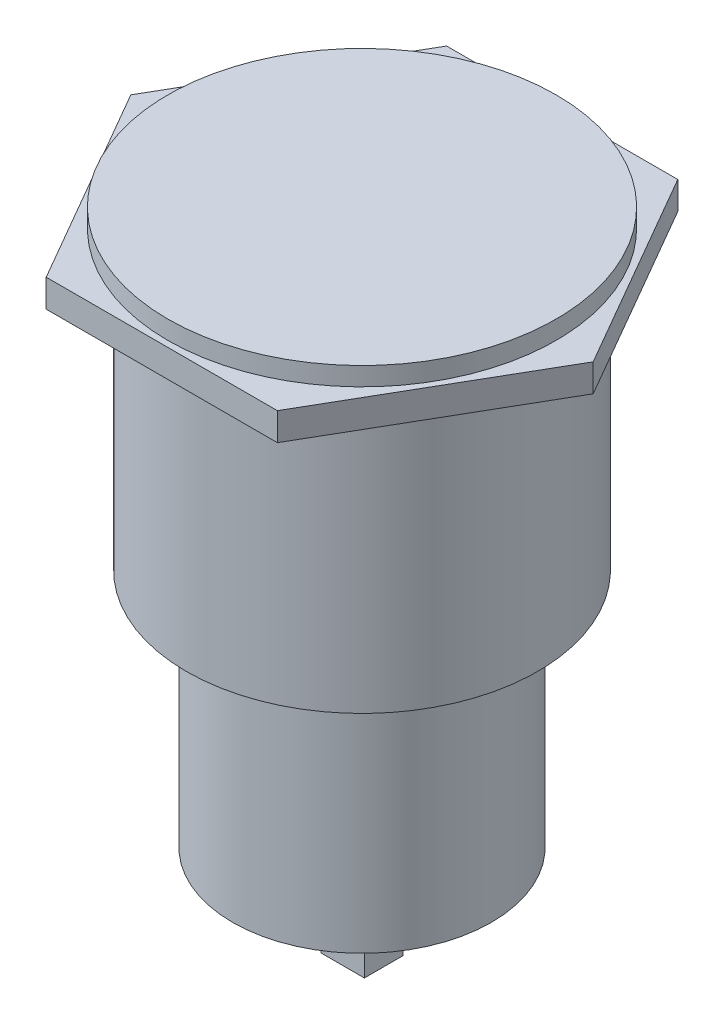
ISO-10303-21;
HEADER;
FILE_DESCRIPTION(('STEP AP214'),'2;1');
FILE_NAME('part.step','',(''),(''),'','','');
FILE_SCHEMA(('AUTOMOTIVE_DESIGN { 1 0 10303 214 1 1 1 1 }'));
ENDSEC;
DATA;
#1=APPLICATION_CONTEXT('core data for automotive mechanical design processes');
#2=APPLICATION_PROTOCOL_DEFINITION('international standard','automotive_design',2000,#1);
#3=PRODUCT_CONTEXT('',#1,'mechanical');
#4=PRODUCT('Part','Part','',(#3));
#5=PRODUCT_RELATED_PRODUCT_CATEGORY('part','',(#4));
#6=PRODUCT_DEFINITION_FORMATION('','',#4);
#7=PRODUCT_DEFINITION_CONTEXT('part definition',#1,'design');
#8=PRODUCT_DEFINITION('design','',#6,#7);
#9=PRODUCT_DEFINITION_SHAPE('','',#8);
#10=(LENGTH_UNIT() NAMED_UNIT(*) SI_UNIT(.MILLI.,.METRE.));
#11=(NAMED_UNIT(*) PLANE_ANGLE_UNIT() SI_UNIT($,.RADIAN.));
#12=(NAMED_UNIT(*) SI_UNIT($,.STERADIAN.) SOLID_ANGLE_UNIT());
#13=UNCERTAINTY_MEASURE_WITH_UNIT(LENGTH_MEASURE(1.E-05),#10,'distance_accuracy_value','');
#14=(GEOMETRIC_REPRESENTATION_CONTEXT(3) GLOBAL_UNCERTAINTY_ASSIGNED_CONTEXT((#13)) GLOBAL_UNIT_ASSIGNED_CONTEXT((#10,
#11,#12)) REPRESENTATION_CONTEXT('',''));
#15=CARTESIAN_POINT('',(0.,0.,0.));
#16=DIRECTION('',(0.,0.,1.));
#17=DIRECTION('',(1.,0.,0.));
#18=AXIS2_PLACEMENT_3D('',#15,#16,#17);
#19=CARTESIAN_POINT('',(0.,-14.5,0.));
#20=DIRECTION('',(0.,1.,0.));
#21=DIRECTION('',(0.,0.,1.));
#22=AXIS2_PLACEMENT_3D('',#19,#20,#21);
#23=CYLINDRICAL_SURFACE('',#22,9.5);
#24=CARTESIAN_POINT('',(0.,-14.5,0.));
#25=DIRECTION('',(0.,1.,0.));
#26=DIRECTION('',(0.,0.,1.));
#27=AXIS2_PLACEMENT_3D('',#24,#25,#26);
#28=CIRCLE('',#27,9.5);
#29=CARTESIAN_POINT('',(0.,-14.5,9.5));
#30=VERTEX_POINT('',#29);
#31=EDGE_CURVE('E187',#30,#30,#28,.T.);
#32=CARTESIAN_POINT('',(0.,0.,0.));
#33=DIRECTION('',(0.,1.,0.));
#34=DIRECTION('',(0.,0.,1.));
#35=AXIS2_PLACEMENT_3D('',#32,#33,#34);
#36=CIRCLE('',#35,9.5);
#37=CARTESIAN_POINT('',(0.,0.,9.5));
#38=VERTEX_POINT('',#37);
#39=EDGE_CURVE('E36',#38,#38,#36,.T.);
#40=CARTESIAN_POINT('',(0.,-14.5,9.5));
#41=CARTESIAN_POINT('',(0.,-14.3489583333333,9.5));
#42=CARTESIAN_POINT('',(0.,-14.1979166666667,9.5));
#43=CARTESIAN_POINT('',(0.,-13.8958333333333,9.5));
#44=CARTESIAN_POINT('',(0.,-13.7447916666667,9.5));
#45=CARTESIAN_POINT('',(0.,-13.4427083333333,9.5));
#46=CARTESIAN_POINT('',(0.,-13.2916666666667,9.5));
#47=CARTESIAN_POINT('',(0.,-12.9895833333333,9.5));
#48=CARTESIAN_POINT('',(0.,-12.8385416666667,9.5));
#49=CARTESIAN_POINT('',(0.,-12.5364583333333,9.5));
#50=CARTESIAN_POINT('',(0.,-12.3854166666667,9.5));
#51=CARTESIAN_POINT('',(0.,-12.0833333333333,9.5));
#52=CARTESIAN_POINT('',(0.,-11.9322916666667,9.5));
#53=CARTESIAN_POINT('',(0.,-11.6302083333333,9.5));
#54=CARTESIAN_POINT('',(0.,-11.4791666666667,9.5));
#55=CARTESIAN_POINT('',(0.,-11.1770833333333,9.5));
#56=CARTESIAN_POINT('',(0.,-11.0260416666667,9.5));
#57=CARTESIAN_POINT('',(0.,-10.7239583333333,9.5));
#58=CARTESIAN_POINT('',(0.,-10.5729166666667,9.5));
#59=CARTESIAN_POINT('',(0.,-10.2708333333333,9.5));
#60=CARTESIAN_POINT('',(0.,-10.1197916666667,9.5));
#61=CARTESIAN_POINT('',(0.,-9.81770833333333,9.5));
#62=CARTESIAN_POINT('',(0.,-9.66666666666667,9.5));
#63=CARTESIAN_POINT('',(0.,-9.36458333333333,9.5));
#64=CARTESIAN_POINT('',(0.,-9.21354166666667,9.5));
#65=CARTESIAN_POINT('',(0.,-8.91145833333333,9.5));
#66=CARTESIAN_POINT('',(0.,-8.76041666666667,9.5));
#67=CARTESIAN_POINT('',(0.,-8.45833333333333,9.5));
#68=CARTESIAN_POINT('',(0.,-8.30729166666667,9.5));
#69=CARTESIAN_POINT('',(0.,-8.00520833333333,9.5));
#70=CARTESIAN_POINT('',(0.,-7.85416666666667,9.5));
#71=CARTESIAN_POINT('',(0.,-7.55208333333333,9.5));
#72=CARTESIAN_POINT('',(0.,-7.40104166666667,9.5));
#73=CARTESIAN_POINT('',(0.,-7.09895833333333,9.5));
#74=CARTESIAN_POINT('',(0.,-6.94791666666667,9.5));
#75=CARTESIAN_POINT('',(0.,-6.64583333333333,9.5));
#76=CARTESIAN_POINT('',(0.,-6.49479166666667,9.5));
#77=CARTESIAN_POINT('',(0.,-6.19270833333334,9.5));
#78=CARTESIAN_POINT('',(0.,-6.04166666666667,9.5));
#79=CARTESIAN_POINT('',(0.,-5.73958333333333,9.5));
#80=CARTESIAN_POINT('',(0.,-5.58854166666667,9.5));
#81=CARTESIAN_POINT('',(0.,-5.28645833333333,9.5));
#82=CARTESIAN_POINT('',(0.,-5.13541666666667,9.5));
#83=CARTESIAN_POINT('',(0.,-4.83333333333333,9.5));
#84=CARTESIAN_POINT('',(0.,-4.68229166666667,9.5));
#85=CARTESIAN_POINT('',(0.,-4.38020833333333,9.5));
#86=CARTESIAN_POINT('',(0.,-4.22916666666667,9.5));
#87=CARTESIAN_POINT('',(0.,-3.92708333333334,9.5));
#88=CARTESIAN_POINT('',(0.,-3.77604166666667,9.5));
#89=CARTESIAN_POINT('',(0.,-3.47395833333333,9.5));
#90=CARTESIAN_POINT('',(0.,-3.32291666666667,9.5));
#91=CARTESIAN_POINT('',(0.,-3.02083333333333,9.5));
#92=CARTESIAN_POINT('',(0.,-2.86979166666667,9.5));
#93=CARTESIAN_POINT('',(0.,-2.56770833333333,9.5));
#94=CARTESIAN_POINT('',(0.,-2.41666666666667,9.5));
#95=CARTESIAN_POINT('',(0.,-2.11458333333333,9.5));
#96=CARTESIAN_POINT('',(0.,-1.96354166666667,9.5));
#97=CARTESIAN_POINT('',(0.,-1.66145833333333,9.5));
#98=CARTESIAN_POINT('',(0.,-1.51041666666667,9.5));
#99=CARTESIAN_POINT('',(0.,-1.20833333333333,9.5));
#100=CARTESIAN_POINT('',(0.,-1.05729166666667,9.5));
#101=CARTESIAN_POINT('',(0.,-0.755208333333334,9.5));
#102=CARTESIAN_POINT('',(0.,-0.604166666666667,9.5));
#103=CARTESIAN_POINT('',(0.,-0.302083333333334,9.5));
#104=CARTESIAN_POINT('',(0.,-0.151041666666667,9.5));
#105=CARTESIAN_POINT('',(0.,0.,9.5));
#106=B_SPLINE_CURVE_WITH_KNOTS('',3,(#40,#41,#42,#43,#44,#45,#46,#47,#48,#49,#50,#51,#52,#53,
#54,#55,#56,#57,#58,#59,#60,#61,#62,#63,#64,#65,#66,#67,#68,#69,#70,#71,#72,#73,#74,#75,#76,#77,
#78,#79,#80,#81,#82,#83,#84,#85,#86,#87,#88,#89,#90,#91,#92,#93,#94,#95,#96,#97,#98,#99,#100,
#101,#102,#103,#104,#105),.UNSPECIFIED.,.F.,.F.,(4,2,2,2,2,2,2,2,2,2,2,2,2,2,2,2,2,2,2,2,2,2,2,
2,2,2,2,2,2,2,2,2,4),(0.,0.453125,0.906250000000001,1.359375,1.8125,2.265625,2.71875,3.171875,
3.625,4.078125,4.53125,4.984375,5.4375,5.890625,6.34375,6.796875,7.25,7.703125,8.15625,8.609375,
9.0625,9.515625,9.96875,10.421875,10.875,11.328125,11.78125,12.234375,12.6875,13.140625,
13.59375,14.046875,14.5),.UNSPECIFIED.);
#107=EDGE_CURVE('BSEAM33',#30,#38,#106,.T.);
#108=ORIENTED_EDGE('',*,*,#31,.T.);
#109=ORIENTED_EDGE('',*,*,#39,.F.);
#110=ORIENTED_EDGE('',*,*,#107,.T.);
#111=ORIENTED_EDGE('',*,*,#107,.F.);
#112=EDGE_LOOP('',(#108,#110,#109,#111));
#113=FACE_BOUND('',#112,.T.);
#114=ADVANCED_FACE('F33',(#113),#23,.T.);
#115=CARTESIAN_POINT('',(0.,-14.5,0.));
#116=DIRECTION('',(0.,1.,0.));
#117=DIRECTION('',(0.,0.,1.));
#118=AXIS2_PLACEMENT_3D('',#115,#116,#117);
#119=PLANE('',#118);
#120=CARTESIAN_POINT('',(0.,-14.5,0.));
#121=DIRECTION('',(0.,-1.,0.));
#122=DIRECTION('',(0.,0.,-1.));
#123=AXIS2_PLACEMENT_3D('',#120,#121,#122);
#124=CIRCLE('',#123,7.);
#125=CARTESIAN_POINT('',(0.,-14.5,-7.));
#126=VERTEX_POINT('',#125);
#127=EDGE_CURVE('E41',#126,#126,#124,.T.);
#128=ORIENTED_EDGE('',*,*,#127,.F.);
#129=EDGE_LOOP('',(#128));
#130=FACE_BOUND('',#129,.T.);
#131=ORIENTED_EDGE('',*,*,#31,.F.);
#132=EDGE_LOOP('',(#131));
#133=FACE_BOUND('',#132,.T.);
#134=ADVANCED_FACE('F198',(#130,#133),#119,.F.);
#135=CARTESIAN_POINT('',(0.,-27.5,0.));
#136=DIRECTION('',(0.,1.,0.));
#137=DIRECTION('',(0.,0.,1.));
#138=AXIS2_PLACEMENT_3D('',#135,#136,#137);
#139=CYLINDRICAL_SURFACE('',#138,7.);
#140=CARTESIAN_POINT('',(0.,-27.5,0.));
#141=DIRECTION('',(0.,-1.,0.));
#142=DIRECTION('',(0.,0.,-1.));
#143=AXIS2_PLACEMENT_3D('',#140,#141,#142);
#144=CIRCLE('',#143,7.);
#145=CARTESIAN_POINT('',(0.,-27.5,-7.));
#146=VERTEX_POINT('',#145);
#147=EDGE_CURVE('E183',#146,#146,#144,.T.);
#148=ORIENTED_EDGE('',*,*,#147,.F.);
#149=EDGE_LOOP('',(#148));
#150=FACE_BOUND('',#149,.T.);
#151=ORIENTED_EDGE('',*,*,#127,.T.);
#152=EDGE_LOOP('',(#151));
#153=FACE_BOUND('',#152,.T.);
#154=ADVANCED_FACE('F202',(#150,#153),#139,.T.);
#155=CARTESIAN_POINT('',(0.,-27.5,0.));
#156=DIRECTION('',(0.,-1.,0.));
#157=DIRECTION('',(0.,0.,-1.));
#158=AXIS2_PLACEMENT_3D('',#155,#156,#157);
#159=PLANE('',#158);
#160=DIRECTION('',(0.,0.,-1.));
#161=VECTOR('',#160,1.);
#162=CARTESIAN_POINT('',(-1.16827262301911,-27.5,-1.04046102148914));
#163=LINE('',#162,#161);
#164=CARTESIAN_POINT('',(-1.16827262301911,-27.5,1.04046102148914));
#165=VERTEX_POINT('',#164);
#166=CARTESIAN_POINT('',(-1.16827262301911,-27.5,-1.04046102148914));
#167=VERTEX_POINT('',#166);
#168=EDGE_CURVE('E49',#165,#167,#163,.T.);
#169=ORIENTED_EDGE('',*,*,#168,.F.);
#170=DIRECTION('',(-1.,0.,0.));
#171=VECTOR('',#170,1.);
#172=CARTESIAN_POINT('',(1.16827262301911,-27.5,1.04046102148914));
#173=LINE('',#172,#171);
#174=CARTESIAN_POINT('',(1.16827262301911,-27.5,1.04046102148914));
#175=VERTEX_POINT('',#174);
#176=EDGE_CURVE('E53',#175,#165,#173,.T.);
#177=ORIENTED_EDGE('',*,*,#176,.F.);
#178=DIRECTION('',(0.,0.,1.));
#179=VECTOR('',#178,1.);
#180=CARTESIAN_POINT('',(1.16827262301911,-27.5,-1.04046102148914));
#181=LINE('',#180,#179);
#182=CARTESIAN_POINT('',(1.16827262301911,-27.5,-1.04046102148914));
#183=VERTEX_POINT('',#182);
#184=EDGE_CURVE('E379',#183,#175,#181,.T.);
#185=ORIENTED_EDGE('',*,*,#184,.F.);
#186=DIRECTION('',(1.,0.,0.));
#187=VECTOR('',#186,1.);
#188=CARTESIAN_POINT('',(1.16827262301911,-27.5,-1.04046102148914));
#189=LINE('',#188,#187);
#190=EDGE_CURVE('E385',#167,#183,#189,.T.);
#191=ORIENTED_EDGE('',*,*,#190,.F.);
#192=EDGE_LOOP('',(#169,#177,#185,#191));
#193=FACE_BOUND('',#192,.T.);
#194=ORIENTED_EDGE('',*,*,#147,.T.);
#195=EDGE_LOOP('',(#194));
#196=FACE_BOUND('',#195,.T.);
#197=ADVANCED_FACE('F207',(#193,#196),#159,.T.);
#198=CARTESIAN_POINT('',(6.25,1.5,10.8253175473055));
#199=DIRECTION('',(-0.866025403784439,0.,-0.499999999999999));
#200=DIRECTION('',(-0.499999999999999,0.,0.866025403784439));
#201=AXIS2_PLACEMENT_3D('',#198,#199,#200);
#202=PLANE('',#201);
#203=DIRECTION('',(0.499999999999999,0.,-0.866025403784439));
#204=VECTOR('',#203,1.);
#205=CARTESIAN_POINT('',(6.25,0.,10.8253175473055));
#206=LINE('',#205,#204);
#207=CARTESIAN_POINT('',(6.25,0.,10.8253175473055));
#208=VERTEX_POINT('',#207);
#209=CARTESIAN_POINT('',(12.5,0.,0.));
#210=VERTEX_POINT('',#209);
#211=EDGE_CURVE('E134',#208,#210,#206,.T.);
#212=ORIENTED_EDGE('',*,*,#211,.T.);
#213=DIRECTION('',(0.,-1.,0.));
#214=VECTOR('',#213,1.);
#215=CARTESIAN_POINT('',(12.5,1.5,0.));
#216=LINE('',#215,#214);
#217=CARTESIAN_POINT('',(12.5,1.5,0.));
#218=VERTEX_POINT('',#217);
#219=EDGE_CURVE('E180',#218,#210,#216,.T.);
#220=ORIENTED_EDGE('',*,*,#219,.F.);
#221=DIRECTION('',(0.499999999999999,0.,-0.866025403784439));
#222=VECTOR('',#221,1.);
#223=CARTESIAN_POINT('',(6.25,1.5,10.8253175473055));
#224=LINE('',#223,#222);
#225=CARTESIAN_POINT('',(6.25,1.5,10.8253175473055));
#226=VERTEX_POINT('',#225);
#227=EDGE_CURVE('E140',#226,#218,#224,.T.);
#228=ORIENTED_EDGE('',*,*,#227,.F.);
#229=DIRECTION('',(0.,-1.,0.));
#230=VECTOR('',#229,1.);
#231=CARTESIAN_POINT('',(6.25,1.5,10.8253175473055));
#232=LINE('',#231,#230);
#233=EDGE_CURVE('E154',#226,#208,#232,.T.);
#234=ORIENTED_EDGE('',*,*,#233,.T.);
#235=EDGE_LOOP('',(#212,#220,#228,#234));
#236=FACE_BOUND('',#235,.T.);
#237=ADVANCED_FACE('F215',(#236),#202,.F.);
#238=CARTESIAN_POINT('',(12.5,1.5,0.));
#239=DIRECTION('',(-0.866025403784438,0.,0.5));
#240=DIRECTION('',(0.5,0.,0.866025403784439));
#241=AXIS2_PLACEMENT_3D('',#238,#239,#240);
#242=PLANE('',#241);
#243=DIRECTION('',(-0.5,0.,-0.866025403784439));
#244=VECTOR('',#243,1.);
#245=CARTESIAN_POINT('',(12.5,0.,0.));
#246=LINE('',#245,#244);
#247=CARTESIAN_POINT('',(6.25,0.,-10.8253175473055));
#248=VERTEX_POINT('',#247);
#249=EDGE_CURVE('E157',#210,#248,#246,.T.);
#250=ORIENTED_EDGE('',*,*,#249,.T.);
#251=DIRECTION('',(0.,-1.,0.));
#252=VECTOR('',#251,1.);
#253=CARTESIAN_POINT('',(6.25,1.5,-10.8253175473055));
#254=LINE('',#253,#252);
#255=CARTESIAN_POINT('',(6.25,1.5,-10.8253175473055));
#256=VERTEX_POINT('',#255);
#257=EDGE_CURVE('E177',#256,#248,#254,.T.);
#258=ORIENTED_EDGE('',*,*,#257,.F.);
#259=DIRECTION('',(-0.5,0.,-0.866025403784439));
#260=VECTOR('',#259,1.);
#261=CARTESIAN_POINT('',(12.5,1.5,0.));
#262=LINE('',#261,#260);
#263=EDGE_CURVE('E143',#218,#256,#262,.T.);
#264=ORIENTED_EDGE('',*,*,#263,.F.);
#265=ORIENTED_EDGE('',*,*,#219,.T.);
#266=EDGE_LOOP('',(#250,#258,#264,#265));
#267=FACE_BOUND('',#266,.T.);
#268=ADVANCED_FACE('F218',(#267),#242,.F.);
#269=CARTESIAN_POINT('',(6.25,1.5,-10.8253175473055));
#270=DIRECTION('',(0.,0.,1.));
#271=DIRECTION('',(1.,0.,0.));
#272=AXIS2_PLACEMENT_3D('',#269,#270,#271);
#273=PLANE('',#272);
#274=DIRECTION('',(-1.,0.,0.));
#275=VECTOR('',#274,1.);
#276=CARTESIAN_POINT('',(6.25,0.,-10.8253175473055));
#277=LINE('',#276,#275);
#278=CARTESIAN_POINT('',(-6.25,0.,-10.8253175473055));
#279=VERTEX_POINT('',#278);
#280=EDGE_CURVE('E159',#248,#279,#277,.T.);
#281=ORIENTED_EDGE('',*,*,#280,.T.);
#282=DIRECTION('',(0.,-1.,0.));
#283=VECTOR('',#282,1.);
#284=CARTESIAN_POINT('',(-6.25,1.5,-10.8253175473055));
#285=LINE('',#284,#283);
#286=CARTESIAN_POINT('',(-6.25,1.5,-10.8253175473055));
#287=VERTEX_POINT('',#286);
#288=EDGE_CURVE('E174',#287,#279,#285,.T.);
#289=ORIENTED_EDGE('',*,*,#288,.F.);
#290=DIRECTION('',(-1.,0.,0.));
#291=VECTOR('',#290,1.);
#292=CARTESIAN_POINT('',(6.25,1.5,-10.8253175473055));
#293=LINE('',#292,#291);
#294=EDGE_CURVE('E146',#256,#287,#293,.T.);
#295=ORIENTED_EDGE('',*,*,#294,.F.);
#296=ORIENTED_EDGE('',*,*,#257,.T.);
#297=EDGE_LOOP('',(#281,#289,#295,#296));
#298=FACE_BOUND('',#297,.T.);
#299=ADVANCED_FACE('F222',(#298),#273,.F.);
#300=CARTESIAN_POINT('',(-6.25,1.5,-10.8253175473055));
#301=DIRECTION('',(0.866025403784439,0.,0.5));
#302=DIRECTION('',(0.5,0.,-0.866025403784439));
#303=AXIS2_PLACEMENT_3D('',#300,#301,#302);
#304=PLANE('',#303);
#305=DIRECTION('',(-0.5,0.,0.866025403784439));
#306=VECTOR('',#305,1.);
#307=CARTESIAN_POINT('',(-6.25,0.,-10.8253175473055));
#308=LINE('',#307,#306);
#309=CARTESIAN_POINT('',(-12.5,0.,0.));
#310=VERTEX_POINT('',#309);
#311=EDGE_CURVE('E161',#279,#310,#308,.T.);
#312=ORIENTED_EDGE('',*,*,#311,.T.);
#313=DIRECTION('',(0.,-1.,0.));
#314=VECTOR('',#313,1.);
#315=CARTESIAN_POINT('',(-12.5,1.5,0.));
#316=LINE('',#315,#314);
#317=CARTESIAN_POINT('',(-12.5,1.5,0.));
#318=VERTEX_POINT('',#317);
#319=EDGE_CURVE('E171',#318,#310,#316,.T.);
#320=ORIENTED_EDGE('',*,*,#319,.F.);
#321=DIRECTION('',(-0.5,0.,0.866025403784439));
#322=VECTOR('',#321,1.);
#323=CARTESIAN_POINT('',(-6.25,1.5,-10.8253175473055));
#324=LINE('',#323,#322);
#325=EDGE_CURVE('E148',#287,#318,#324,.T.);
#326=ORIENTED_EDGE('',*,*,#325,.F.);
#327=ORIENTED_EDGE('',*,*,#288,.T.);
#328=EDGE_LOOP('',(#312,#320,#326,#327));
#329=FACE_BOUND('',#328,.T.);
#330=ADVANCED_FACE('F226',(#329),#304,.F.);
#331=CARTESIAN_POINT('',(-12.5,1.5,0.));
#332=DIRECTION('',(0.866025403784439,0.,-0.5));
#333=DIRECTION('',(-0.5,0.,-0.866025403784439));
#334=AXIS2_PLACEMENT_3D('',#331,#332,#333);
#335=PLANE('',#334);
#336=DIRECTION('',(0.5,0.,0.866025403784439));
#337=VECTOR('',#336,1.);
#338=CARTESIAN_POINT('',(-12.5,0.,0.));
#339=LINE('',#338,#337);
#340=CARTESIAN_POINT('',(-6.25,0.,10.8253175473055));
#341=VERTEX_POINT('',#340);
#342=EDGE_CURVE('E163',#310,#341,#339,.T.);
#343=ORIENTED_EDGE('',*,*,#342,.T.);
#344=DIRECTION('',(0.,-1.,0.));
#345=VECTOR('',#344,1.);
#346=CARTESIAN_POINT('',(-6.25,1.5,10.8253175473055));
#347=LINE('',#346,#345);
#348=CARTESIAN_POINT('',(-6.25,1.5,10.8253175473055));
#349=VERTEX_POINT('',#348);
#350=EDGE_CURVE('E168',#349,#341,#347,.T.);
#351=ORIENTED_EDGE('',*,*,#350,.F.);
#352=DIRECTION('',(0.5,0.,0.866025403784439));
#353=VECTOR('',#352,1.);
#354=CARTESIAN_POINT('',(-12.5,1.5,0.));
#355=LINE('',#354,#353);
#356=EDGE_CURVE('E150',#318,#349,#355,.T.);
#357=ORIENTED_EDGE('',*,*,#356,.F.);
#358=ORIENTED_EDGE('',*,*,#319,.T.);
#359=EDGE_LOOP('',(#343,#351,#357,#358));
#360=FACE_BOUND('',#359,.T.);
#361=ADVANCED_FACE('F230',(#360),#335,.F.);
#362=CARTESIAN_POINT('',(-6.25,1.5,10.8253175473055));
#363=DIRECTION('',(0.,0.,-1.));
#364=DIRECTION('',(-1.,0.,0.));
#365=AXIS2_PLACEMENT_3D('',#362,#363,#364);
#366=PLANE('',#365);
#367=DIRECTION('',(1.,0.,0.));
#368=VECTOR('',#367,1.);
#369=CARTESIAN_POINT('',(-6.25,0.,10.8253175473055));
#370=LINE('',#369,#368);
#371=EDGE_CURVE('E144',#341,#208,#370,.T.);
#372=ORIENTED_EDGE('',*,*,#371,.T.);
#373=ORIENTED_EDGE('',*,*,#233,.F.);
#374=DIRECTION('',(1.,0.,0.));
#375=VECTOR('',#374,1.);
#376=CARTESIAN_POINT('',(-6.25,1.5,10.8253175473055));
#377=LINE('',#376,#375);
#378=EDGE_CURVE('E152',#349,#226,#377,.T.);
#379=ORIENTED_EDGE('',*,*,#378,.F.);
#380=ORIENTED_EDGE('',*,*,#350,.T.);
#381=EDGE_LOOP('',(#372,#373,#379,#380));
#382=FACE_BOUND('',#381,.T.);
#383=ADVANCED_FACE('F234',(#382),#366,.F.);
#384=CARTESIAN_POINT('',(0.,1.5,0.));
#385=DIRECTION('',(0.,1.,0.));
#386=DIRECTION('',(0.,0.,1.));
#387=AXIS2_PLACEMENT_3D('',#384,#385,#386);
#388=PLANE('',#387);
#389=CARTESIAN_POINT('',(0.,1.5,0.));
#390=DIRECTION('',(0.,1.,0.));
#391=DIRECTION('',(0.,0.,1.));
#392=AXIS2_PLACEMENT_3D('',#389,#390,#391);
#393=CIRCLE('',#392,10.5);
#394=CARTESIAN_POINT('',(0.,1.5,10.5));
#395=VERTEX_POINT('',#394);
#396=EDGE_CURVE('E11',#395,#395,#393,.T.);
#397=ORIENTED_EDGE('',*,*,#396,.F.);
#398=EDGE_LOOP('',(#397));
#399=FACE_BOUND('',#398,.T.);
#400=ORIENTED_EDGE('',*,*,#227,.T.);
#401=ORIENTED_EDGE('',*,*,#263,.T.);
#402=ORIENTED_EDGE('',*,*,#294,.T.);
#403=ORIENTED_EDGE('',*,*,#325,.T.);
#404=ORIENTED_EDGE('',*,*,#356,.T.);
#405=ORIENTED_EDGE('',*,*,#378,.T.);
#406=EDGE_LOOP('',(#400,#401,#402,#403,#404,#405));
#407=FACE_BOUND('',#406,.T.);
#408=ADVANCED_FACE('F238',(#399,#407),#388,.T.);
#409=CARTESIAN_POINT('',(0.,0.,0.));
#410=DIRECTION('',(0.,1.,0.));
#411=DIRECTION('',(0.,0.,1.));
#412=AXIS2_PLACEMENT_3D('',#409,#410,#411);
#413=PLANE('',#412);
#414=ORIENTED_EDGE('',*,*,#39,.T.);
#415=EDGE_LOOP('',(#414));
#416=FACE_BOUND('',#415,.T.);
#417=ORIENTED_EDGE('',*,*,#211,.F.);
#418=ORIENTED_EDGE('',*,*,#371,.F.);
#419=ORIENTED_EDGE('',*,*,#342,.F.);
#420=ORIENTED_EDGE('',*,*,#311,.F.);
#421=ORIENTED_EDGE('',*,*,#280,.F.);
#422=ORIENTED_EDGE('',*,*,#249,.F.);
#423=EDGE_LOOP('',(#417,#418,#419,#420,#421,#422));
#424=FACE_BOUND('',#423,.T.);
#425=ADVANCED_FACE('F194',(#416,#424),#413,.F.);
#426=CARTESIAN_POINT('',(0.,2.5,0.));
#427=DIRECTION('',(0.,-1.,0.));
#428=DIRECTION('',(0.,0.,-1.));
#429=AXIS2_PLACEMENT_3D('',#426,#427,#428);
#430=CYLINDRICAL_SURFACE('',#429,10.5);
#431=CARTESIAN_POINT('',(0.,2.5,0.));
#432=DIRECTION('',(0.,1.,0.));
#433=DIRECTION('',(0.,0.,1.));
#434=AXIS2_PLACEMENT_3D('',#431,#432,#433);
#435=CIRCLE('',#434,10.5);
#436=CARTESIAN_POINT('',(0.,2.5,10.5));
#437=VERTEX_POINT('',#436);
#438=EDGE_CURVE('E131',#437,#437,#435,.T.);
#439=ORIENTED_EDGE('',*,*,#438,.F.);
#440=EDGE_LOOP('',(#439));
#441=FACE_BOUND('',#440,.T.);
#442=ORIENTED_EDGE('',*,*,#396,.T.);
#443=EDGE_LOOP('',(#442));
#444=FACE_BOUND('',#443,.T.);
#445=ADVANCED_FACE('F242',(#441,#444),#430,.T.);
#446=CARTESIAN_POINT('',(0.,2.5,0.));
#447=DIRECTION('',(0.,1.,0.));
#448=DIRECTION('',(0.,0.,1.));
#449=AXIS2_PLACEMENT_3D('',#446,#447,#448);
#450=PLANE('',#449);
#451=ORIENTED_EDGE('',*,*,#438,.T.);
#452=EDGE_LOOP('',(#451));
#453=FACE_BOUND('',#452,.T.);
#454=ADVANCED_FACE('F248',(#453),#450,.T.);
#455=CARTESIAN_POINT('',(-1.16827262301911,-32.5,-1.04046102148914));
#456=DIRECTION('',(1.,0.,0.));
#457=DIRECTION('',(0.,0.,-1.));
#458=AXIS2_PLACEMENT_3D('',#455,#456,#457);
#459=PLANE('',#458);
#460=ORIENTED_EDGE('',*,*,#168,.T.);
#461=DIRECTION('',(0.,1.,0.));
#462=VECTOR('',#461,1.);
#463=CARTESIAN_POINT('',(-1.16827262301911,-32.5,-1.04046102148914));
#464=LINE('',#463,#462);
#465=CARTESIAN_POINT('',(-1.16827262301911,-32.5,-1.04046102148914));
#466=VERTEX_POINT('',#465);
#467=EDGE_CURVE('E114',#466,#167,#464,.T.);
#468=ORIENTED_EDGE('',*,*,#467,.F.);
#469=DIRECTION('',(0.,0.,-1.));
#470=VECTOR('',#469,1.);
#471=CARTESIAN_POINT('',(-1.16827262301911,-32.5,-1.04046102148914));
#472=LINE('',#471,#470);
#473=CARTESIAN_POINT('',(-1.16827262301911,-32.5,1.04046102148914));
#474=VERTEX_POINT('',#473);
#475=EDGE_CURVE('E120',#474,#466,#472,.T.);
#476=ORIENTED_EDGE('',*,*,#475,.F.);
#477=DIRECTION('',(0.,1.,0.));
#478=VECTOR('',#477,1.);
#479=CARTESIAN_POINT('',(-1.16827262301911,-32.5,1.04046102148914));
#480=LINE('',#479,#478);
#481=EDGE_CURVE('E377',#474,#165,#480,.T.);
#482=ORIENTED_EDGE('',*,*,#481,.T.);
#483=EDGE_LOOP('',(#460,#468,#476,#482));
#484=FACE_BOUND('',#483,.T.);
#485=ADVANCED_FACE('F130',(#484),#459,.F.);
#486=CARTESIAN_POINT('',(1.16827262301911,-32.5,-1.04046102148914));
#487=DIRECTION('',(0.,0.,1.));
#488=DIRECTION('',(1.,0.,0.));
#489=AXIS2_PLACEMENT_3D('',#486,#487,#488);
#490=PLANE('',#489);
#491=ORIENTED_EDGE('',*,*,#190,.T.);
#492=DIRECTION('',(0.,1.,0.));
#493=VECTOR('',#492,1.);
#494=CARTESIAN_POINT('',(1.16827262301911,-32.5,-1.04046102148914));
#495=LINE('',#494,#493);
#496=CARTESIAN_POINT('',(1.16827262301911,-32.5,-1.04046102148914));
#497=VERTEX_POINT('',#496);
#498=EDGE_CURVE('E116',#497,#183,#495,.T.);
#499=ORIENTED_EDGE('',*,*,#498,.F.);
#500=DIRECTION('',(1.,0.,0.));
#501=VECTOR('',#500,1.);
#502=CARTESIAN_POINT('',(1.16827262301911,-32.5,-1.04046102148914));
#503=LINE('',#502,#501);
#504=EDGE_CURVE('E109',#466,#497,#503,.T.);
#505=ORIENTED_EDGE('',*,*,#504,.F.);
#506=ORIENTED_EDGE('',*,*,#467,.T.);
#507=EDGE_LOOP('',(#491,#499,#505,#506));
#508=FACE_BOUND('',#507,.T.);
#509=ADVANCED_FACE('F112',(#508),#490,.F.);
#510=CARTESIAN_POINT('',(1.16827262301911,-32.5,-1.04046102148914));
#511=DIRECTION('',(-1.,0.,0.));
#512=DIRECTION('',(0.,0.,1.));
#513=AXIS2_PLACEMENT_3D('',#510,#511,#512);
#514=PLANE('',#513);
#515=ORIENTED_EDGE('',*,*,#184,.T.);
#516=DIRECTION('',(0.,1.,0.));
#517=VECTOR('',#516,1.);
#518=CARTESIAN_POINT('',(1.16827262301911,-32.5,1.04046102148914));
#519=LINE('',#518,#517);
#520=CARTESIAN_POINT('',(1.16827262301911,-32.5,1.04046102148914));
#521=VERTEX_POINT('',#520);
#522=EDGE_CURVE('E136',#521,#175,#519,.T.);
#523=ORIENTED_EDGE('',*,*,#522,.F.);
#524=DIRECTION('',(0.,0.,1.));
#525=VECTOR('',#524,1.);
#526=CARTESIAN_POINT('',(1.16827262301911,-32.5,-1.04046102148914));
#527=LINE('',#526,#525);
#528=EDGE_CURVE('E119',#497,#521,#527,.T.);
#529=ORIENTED_EDGE('',*,*,#528,.F.);
#530=ORIENTED_EDGE('',*,*,#498,.T.);
#531=EDGE_LOOP('',(#515,#523,#529,#530));
#532=FACE_BOUND('',#531,.T.);
#533=ADVANCED_FACE('F257',(#532),#514,.F.);
#534=CARTESIAN_POINT('',(1.16827262301911,-32.5,1.04046102148914));
#535=DIRECTION('',(0.,0.,-1.));
#536=DIRECTION('',(-1.,0.,0.));
#537=AXIS2_PLACEMENT_3D('',#534,#535,#536);
#538=PLANE('',#537);
#539=ORIENTED_EDGE('',*,*,#176,.T.);
#540=ORIENTED_EDGE('',*,*,#481,.F.);
#541=DIRECTION('',(-1.,0.,0.));
#542=VECTOR('',#541,1.);
#543=CARTESIAN_POINT('',(1.16827262301911,-32.5,1.04046102148914));
#544=LINE('',#543,#542);
#545=EDGE_CURVE('E125',#521,#474,#544,.T.);
#546=ORIENTED_EDGE('',*,*,#545,.F.);
#547=ORIENTED_EDGE('',*,*,#522,.T.);
#548=EDGE_LOOP('',(#539,#540,#546,#547));
#549=FACE_BOUND('',#548,.T.);
#550=ADVANCED_FACE('F260',(#549),#538,.F.);
#551=CARTESIAN_POINT('',(0.,-32.5,0.));
#552=DIRECTION('',(0.,-1.,0.));
#553=DIRECTION('',(0.,0.,-1.));
#554=AXIS2_PLACEMENT_3D('',#551,#552,#553);
#555=PLANE('',#554);
#556=ORIENTED_EDGE('',*,*,#475,.T.);
#557=ORIENTED_EDGE('',*,*,#504,.T.);
#558=ORIENTED_EDGE('',*,*,#528,.T.);
#559=ORIENTED_EDGE('',*,*,#545,.T.);
#560=EDGE_LOOP('',(#556,#557,#558,#559));
#561=FACE_BOUND('',#560,.T.);
#562=ADVANCED_FACE('F123',(#561),#555,.T.);
#563=CLOSED_SHELL('',(#114,#134,#154,#197,#237,#268,#299,#330,#361,#383,#408,#425,#445,#454,
#485,#509,#533,#550,#562));
#564=MANIFOLD_SOLID_BREP('B2',#563);
#565=ADVANCED_BREP_SHAPE_REPRESENTATION('',(#18,#564),#14);
#566=SHAPE_DEFINITION_REPRESENTATION(#9,#565);
ENDSEC;
END-ISO-10303-21;
